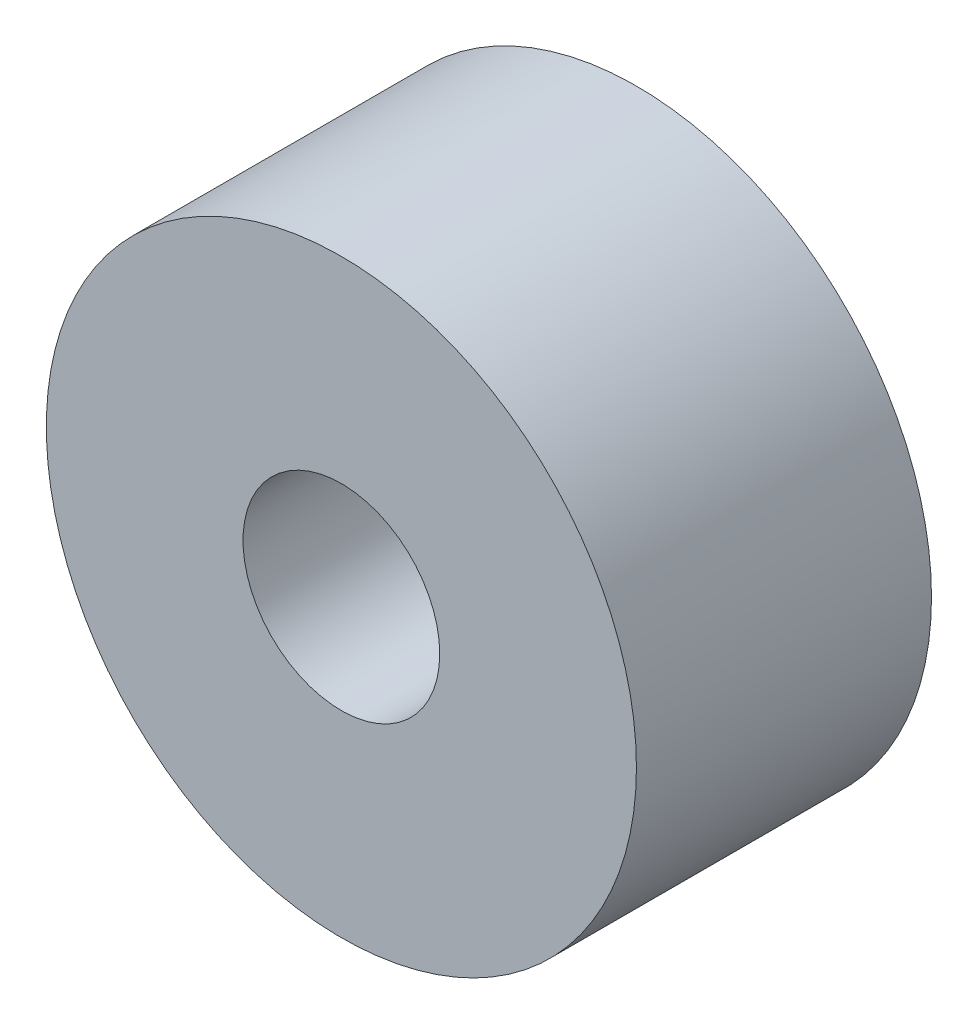
ISO-10303-21;
HEADER;
FILE_DESCRIPTION(('STEP AP214'),'2;1');
FILE_NAME('part.step','',(''),(''),'','','');
FILE_SCHEMA(('AUTOMOTIVE_DESIGN { 1 0 10303 214 1 1 1 1 }'));
ENDSEC;
DATA;
#1=APPLICATION_CONTEXT('core data for automotive mechanical design processes');
#2=APPLICATION_PROTOCOL_DEFINITION('international standard','automotive_design',2000,#1);
#3=PRODUCT_CONTEXT('',#1,'mechanical');
#4=PRODUCT('Part','Part','',(#3));
#5=PRODUCT_RELATED_PRODUCT_CATEGORY('part','',(#4));
#6=PRODUCT_DEFINITION_FORMATION('','',#4);
#7=PRODUCT_DEFINITION_CONTEXT('part definition',#1,'design');
#8=PRODUCT_DEFINITION('design','',#6,#7);
#9=PRODUCT_DEFINITION_SHAPE('','',#8);
#10=(LENGTH_UNIT() NAMED_UNIT(*) SI_UNIT(.MILLI.,.METRE.));
#11=(NAMED_UNIT(*) PLANE_ANGLE_UNIT() SI_UNIT($,.RADIAN.));
#12=(NAMED_UNIT(*) SI_UNIT($,.STERADIAN.) SOLID_ANGLE_UNIT());
#13=UNCERTAINTY_MEASURE_WITH_UNIT(LENGTH_MEASURE(1.E-05),#10,'distance_accuracy_value','');
#14=(GEOMETRIC_REPRESENTATION_CONTEXT(3) GLOBAL_UNCERTAINTY_ASSIGNED_CONTEXT((#13)) GLOBAL_UNIT_ASSIGNED_CONTEXT((#10,
#11,#12)) REPRESENTATION_CONTEXT('',''));
#15=CARTESIAN_POINT('',(0.,0.,0.));
#16=DIRECTION('',(0.,0.,1.));
#17=DIRECTION('',(1.,0.,0.));
#18=AXIS2_PLACEMENT_3D('',#15,#16,#17);
#19=CARTESIAN_POINT('',(0.,0.,3.));
#20=DIRECTION('',(0.,0.,1.));
#21=DIRECTION('',(1.,0.,0.));
#22=AXIS2_PLACEMENT_3D('',#19,#20,#21);
#23=PLANE('',#22);
#24=CARTESIAN_POINT('',(0.,0.,3.));
#25=DIRECTION('',(0.,0.,1.));
#26=DIRECTION('',(1.,0.,0.));
#27=AXIS2_PLACEMENT_3D('',#24,#25,#26);
#28=CIRCLE('',#27,3.);
#29=CARTESIAN_POINT('',(3.,0.,3.));
#30=VERTEX_POINT('',#29);
#31=EDGE_CURVE('E10',#30,#30,#28,.T.);
#32=ORIENTED_EDGE('',*,*,#31,.T.);
#33=EDGE_LOOP('',(#32));
#34=FACE_BOUND('',#33,.T.);
#35=CARTESIAN_POINT('',(0.,0.,3.));
#36=DIRECTION('',(0.,0.,1.));
#37=DIRECTION('',(1.,0.,0.));
#38=AXIS2_PLACEMENT_3D('',#35,#36,#37);
#39=CIRCLE('',#38,1.);
#40=CARTESIAN_POINT('',(1.,0.,3.));
#41=VERTEX_POINT('',#40);
#42=EDGE_CURVE('E50',#41,#41,#39,.T.);
#43=ORIENTED_EDGE('',*,*,#42,.F.);
#44=EDGE_LOOP('',(#43));
#45=FACE_BOUND('',#44,.T.);
#46=ADVANCED_FACE('F37',(#34,#45),#23,.T.);
#47=CARTESIAN_POINT('',(0.,0.,0.));
#48=DIRECTION('',(0.,0.,1.));
#49=DIRECTION('',(1.,0.,0.));
#50=AXIS2_PLACEMENT_3D('',#47,#48,#49);
#51=PLANE('',#50);
#52=CARTESIAN_POINT('',(0.,0.,0.));
#53=DIRECTION('',(0.,0.,1.));
#54=DIRECTION('',(1.,0.,0.));
#55=AXIS2_PLACEMENT_3D('',#52,#53,#54);
#56=CIRCLE('',#55,3.);
#57=CARTESIAN_POINT('',(3.,0.,0.));
#58=VERTEX_POINT('',#57);
#59=EDGE_CURVE('E41',#58,#58,#56,.T.);
#60=ORIENTED_EDGE('',*,*,#59,.F.);
#61=EDGE_LOOP('',(#60));
#62=FACE_BOUND('',#61,.T.);
#63=CARTESIAN_POINT('',(0.,0.,0.));
#64=DIRECTION('',(0.,0.,1.));
#65=DIRECTION('',(1.,0.,0.));
#66=AXIS2_PLACEMENT_3D('',#63,#64,#65);
#67=CIRCLE('',#66,1.);
#68=CARTESIAN_POINT('',(1.,0.,0.));
#69=VERTEX_POINT('',#68);
#70=EDGE_CURVE('E52',#69,#69,#67,.T.);
#71=ORIENTED_EDGE('',*,*,#70,.T.);
#72=EDGE_LOOP('',(#71));
#73=FACE_BOUND('',#72,.T.);
#74=ADVANCED_FACE('F64',(#62,#73),#51,.F.);
#75=CARTESIAN_POINT('',(0.,0.,3.));
#76=DIRECTION('',(0.,0.,-1.));
#77=DIRECTION('',(-1.,0.,0.));
#78=AXIS2_PLACEMENT_3D('',#75,#76,#77);
#79=CYLINDRICAL_SURFACE('',#78,3.);
#80=ORIENTED_EDGE('',*,*,#31,.F.);
#81=EDGE_LOOP('',(#80));
#82=FACE_BOUND('',#81,.T.);
#83=ORIENTED_EDGE('',*,*,#59,.T.);
#84=EDGE_LOOP('',(#83));
#85=FACE_BOUND('',#84,.T.);
#86=ADVANCED_FACE('F39',(#82,#85),#79,.T.);
#87=CARTESIAN_POINT('',(0.,0.,3.));
#88=DIRECTION('',(0.,0.,-1.));
#89=DIRECTION('',(-1.,0.,0.));
#90=AXIS2_PLACEMENT_3D('',#87,#88,#89);
#91=CYLINDRICAL_SURFACE('',#90,1.);
#92=ORIENTED_EDGE('',*,*,#42,.T.);
#93=EDGE_LOOP('',(#92));
#94=FACE_BOUND('',#93,.T.);
#95=ORIENTED_EDGE('',*,*,#70,.F.);
#96=EDGE_LOOP('',(#95));
#97=FACE_BOUND('',#96,.T.);
#98=ADVANCED_FACE('F60',(#94,#97),#91,.F.);
#99=CLOSED_SHELL('',(#46,#74,#86,#98));
#100=MANIFOLD_SOLID_BREP('B2',#99);
#101=ADVANCED_BREP_SHAPE_REPRESENTATION('',(#18,#100),#14);
#102=SHAPE_DEFINITION_REPRESENTATION(#9,#101);
ENDSEC;
END-ISO-10303-21;
